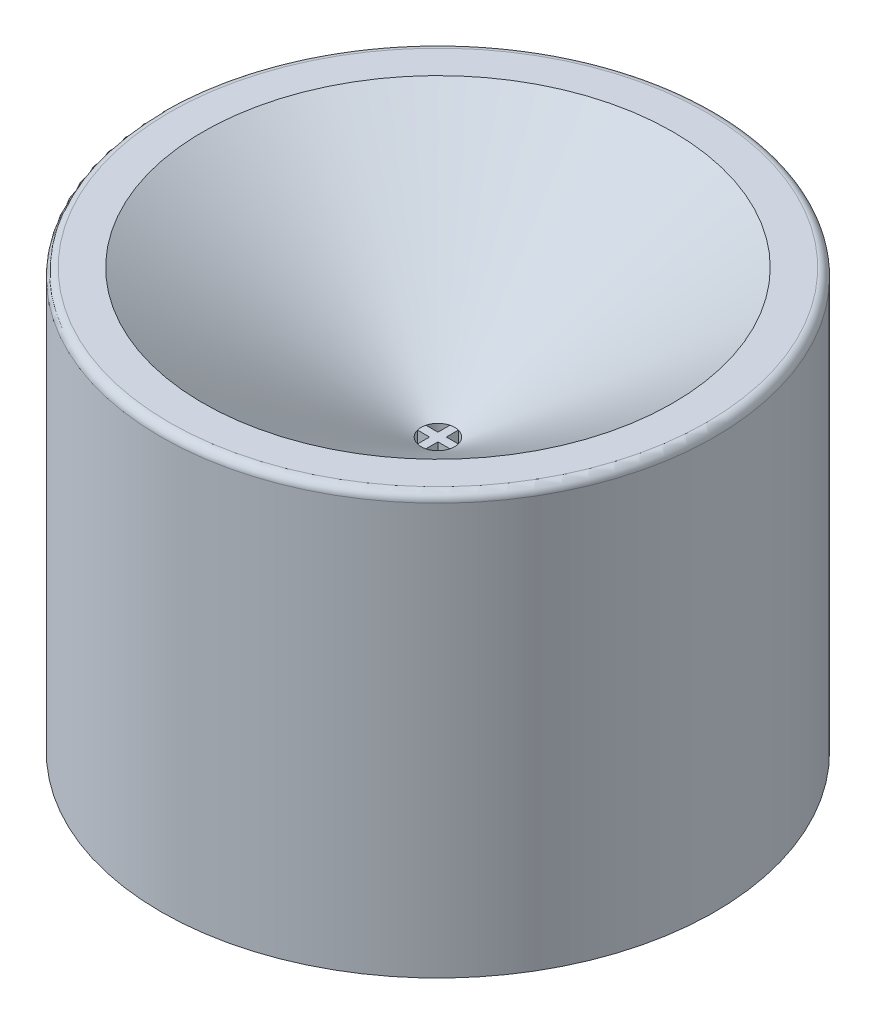
ISO-10303-21;
HEADER;
FILE_DESCRIPTION(('STEP AP214'),'2;1');
FILE_NAME('part.step','',(''),(''),'','','');
FILE_SCHEMA(('AUTOMOTIVE_DESIGN { 1 0 10303 214 1 1 1 1 }'));
ENDSEC;
DATA;
#1=APPLICATION_CONTEXT('core data for automotive mechanical design processes');
#2=APPLICATION_PROTOCOL_DEFINITION('international standard','automotive_design',2000,#1);
#3=PRODUCT_CONTEXT('',#1,'mechanical');
#4=PRODUCT('Part','Part','',(#3));
#5=PRODUCT_RELATED_PRODUCT_CATEGORY('part','',(#4));
#6=PRODUCT_DEFINITION_FORMATION('','',#4);
#7=PRODUCT_DEFINITION_CONTEXT('part definition',#1,'design');
#8=PRODUCT_DEFINITION('design','',#6,#7);
#9=PRODUCT_DEFINITION_SHAPE('','',#8);
#10=(LENGTH_UNIT() NAMED_UNIT(*) SI_UNIT(.MILLI.,.METRE.));
#11=(NAMED_UNIT(*) PLANE_ANGLE_UNIT() SI_UNIT($,.RADIAN.));
#12=(NAMED_UNIT(*) SI_UNIT($,.STERADIAN.) SOLID_ANGLE_UNIT());
#13=UNCERTAINTY_MEASURE_WITH_UNIT(LENGTH_MEASURE(1.E-05),#10,'distance_accuracy_value','');
#14=(GEOMETRIC_REPRESENTATION_CONTEXT(3) GLOBAL_UNCERTAINTY_ASSIGNED_CONTEXT((#13)) GLOBAL_UNIT_ASSIGNED_CONTEXT((#10,
#11,#12)) REPRESENTATION_CONTEXT('',''));
#15=CARTESIAN_POINT('',(0.,0.,0.));
#16=DIRECTION('',(0.,0.,1.));
#17=DIRECTION('',(1.,0.,0.));
#18=AXIS2_PLACEMENT_3D('',#15,#16,#17);
#19=CARTESIAN_POINT('',(-5.08,82.55,0.));
#20=DIRECTION('',(0.,1.,0.));
#21=DIRECTION('',(0.,0.,1.));
#22=AXIS2_PLACEMENT_3D('',#19,#20,#21);
#23=PLANE('',#22);
#24=DIRECTION('',(0.,0.,1.));
#25=VECTOR('',#24,1.);
#26=CARTESIAN_POINT('',(1.27,82.55,0.));
#27=LINE('',#26,#25);
#28=CARTESIAN_POINT('',(1.27,82.55,-4.91868884968342));
#29=VERTEX_POINT('',#28);
#30=CARTESIAN_POINT('',(1.27,82.55,-1.27));
#31=VERTEX_POINT('',#30);
#32=EDGE_CURVE('E55',#29,#31,#27,.T.);
#33=ORIENTED_EDGE('',*,*,#32,.F.);
#34=CARTESIAN_POINT('',(0.,82.55,0.));
#35=DIRECTION('',(0.,-1.,0.));
#36=DIRECTION('',(0.,0.,-1.));
#37=AXIS2_PLACEMENT_3D('',#34,#35,#36);
#38=CIRCLE('',#37,5.08);
#39=CARTESIAN_POINT('',(-1.27,82.55,-4.91868884968342));
#40=VERTEX_POINT('',#39);
#41=EDGE_CURVE('E229',#40,#29,#38,.T.);
#42=ORIENTED_EDGE('',*,*,#41,.F.);
#43=DIRECTION('',(0.,0.,1.));
#44=VECTOR('',#43,1.);
#45=CARTESIAN_POINT('',(-1.27,82.55,0.));
#46=LINE('',#45,#44);
#47=CARTESIAN_POINT('',(-1.27,82.55,-1.27));
#48=VERTEX_POINT('',#47);
#49=EDGE_CURVE('E212',#40,#48,#46,.T.);
#50=ORIENTED_EDGE('',*,*,#49,.T.);
#51=DIRECTION('',(1.,0.,0.));
#52=VECTOR('',#51,1.);
#53=CARTESIAN_POINT('',(0.,82.55,-1.27));
#54=LINE('',#53,#52);
#55=CARTESIAN_POINT('',(-4.91868884968342,82.55,-1.27));
#56=VERTEX_POINT('',#55);
#57=EDGE_CURVE('E210',#56,#48,#54,.T.);
#58=ORIENTED_EDGE('',*,*,#57,.F.);
#59=CARTESIAN_POINT('',(-4.91868884968342,82.55,1.27));
#60=VERTEX_POINT('',#59);
#61=EDGE_CURVE('E568',#60,#56,#38,.T.);
#62=ORIENTED_EDGE('',*,*,#61,.F.);
#63=DIRECTION('',(1.,0.,0.));
#64=VECTOR('',#63,1.);
#65=CARTESIAN_POINT('',(0.,82.55,1.27));
#66=LINE('',#65,#64);
#67=CARTESIAN_POINT('',(-1.27,82.55,1.27));
#68=VERTEX_POINT('',#67);
#69=EDGE_CURVE('E185',#60,#68,#66,.T.);
#70=ORIENTED_EDGE('',*,*,#69,.T.);
#71=DIRECTION('',(0.,0.,1.));
#72=VECTOR('',#71,1.);
#73=CARTESIAN_POINT('',(-1.27,82.55,0.));
#74=LINE('',#73,#72);
#75=CARTESIAN_POINT('',(-1.27,82.55,4.91868884968342));
#76=VERTEX_POINT('',#75);
#77=EDGE_CURVE('E190',#68,#76,#74,.T.);
#78=ORIENTED_EDGE('',*,*,#77,.T.);
#79=CARTESIAN_POINT('',(1.27,82.55,4.91868884968342));
#80=VERTEX_POINT('',#79);
#81=EDGE_CURVE('E565',#80,#76,#38,.T.);
#82=ORIENTED_EDGE('',*,*,#81,.F.);
#83=DIRECTION('',(0.,0.,1.));
#84=VECTOR('',#83,1.);
#85=CARTESIAN_POINT('',(1.27,82.55,0.));
#86=LINE('',#85,#84);
#87=CARTESIAN_POINT('',(1.27,82.55,1.27));
#88=VERTEX_POINT('',#87);
#89=EDGE_CURVE('E151',#88,#80,#86,.T.);
#90=ORIENTED_EDGE('',*,*,#89,.F.);
#91=DIRECTION('',(1.,0.,0.));
#92=VECTOR('',#91,1.);
#93=CARTESIAN_POINT('',(0.,82.55,1.27));
#94=LINE('',#93,#92);
#95=CARTESIAN_POINT('',(4.91868884968342,82.55,1.27));
#96=VERTEX_POINT('',#95);
#97=EDGE_CURVE('E63',#88,#96,#94,.T.);
#98=ORIENTED_EDGE('',*,*,#97,.T.);
#99=CARTESIAN_POINT('',(4.91868884968342,82.55,-1.27));
#100=VERTEX_POINT('',#99);
#101=EDGE_CURVE('E242',#100,#96,#38,.T.);
#102=ORIENTED_EDGE('',*,*,#101,.F.);
#103=DIRECTION('',(1.,0.,0.));
#104=VECTOR('',#103,1.);
#105=CARTESIAN_POINT('',(0.,82.55,-1.27));
#106=LINE('',#105,#104);
#107=EDGE_CURVE('E167',#31,#100,#106,.T.);
#108=ORIENTED_EDGE('',*,*,#107,.F.);
#109=EDGE_LOOP('',(#33,#42,#50,#58,#62,#70,#78,#82,#90,#98,#102,#108));
#110=FACE_BOUND('',#109,.T.);
#111=ADVANCED_FACE('F40',(#110),#23,.T.);
#112=CARTESIAN_POINT('',(-5.08,76.2,0.));
#113=DIRECTION('',(0.,1.,0.));
#114=DIRECTION('',(0.,0.,1.));
#115=AXIS2_PLACEMENT_3D('',#112,#113,#114);
#116=PLANE('',#115);
#117=CARTESIAN_POINT('',(0.,76.2,0.));
#118=DIRECTION('',(0.,1.,0.));
#119=DIRECTION('',(0.,0.,1.));
#120=AXIS2_PLACEMENT_3D('',#117,#118,#119);
#121=CIRCLE('',#120,5.08);
#122=CARTESIAN_POINT('',(1.27,76.2,-4.91868884968342));
#123=VERTEX_POINT('',#122);
#124=CARTESIAN_POINT('',(4.91868884968342,76.2,-1.27));
#125=VERTEX_POINT('',#124);
#126=EDGE_CURVE('E160',#123,#125,#121,.F.);
#127=ORIENTED_EDGE('',*,*,#126,.F.);
#128=DIRECTION('',(0.,0.,-1.));
#129=VECTOR('',#128,1.);
#130=CARTESIAN_POINT('',(1.27,76.2,0.));
#131=LINE('',#130,#129);
#132=CARTESIAN_POINT('',(1.26999999999999,76.2,-1.27));
#133=VERTEX_POINT('',#132);
#134=EDGE_CURVE('E162',#133,#123,#131,.T.);
#135=ORIENTED_EDGE('',*,*,#134,.F.);
#136=DIRECTION('',(-1.,0.,0.));
#137=VECTOR('',#136,1.);
#138=CARTESIAN_POINT('',(0.,76.2,-1.27));
#139=LINE('',#138,#137);
#140=EDGE_CURVE('E173',#125,#133,#139,.T.);
#141=ORIENTED_EDGE('',*,*,#140,.F.);
#142=EDGE_LOOP('',(#127,#135,#141));
#143=FACE_BOUND('',#142,.T.);
#144=DIRECTION('',(-1.,0.,0.));
#145=VECTOR('',#144,1.);
#146=CARTESIAN_POINT('',(0.,76.2,1.27));
#147=LINE('',#146,#145);
#148=CARTESIAN_POINT('',(4.91868884968342,76.2,1.27));
#149=VERTEX_POINT('',#148);
#150=CARTESIAN_POINT('',(1.27,76.2,1.27));
#151=VERTEX_POINT('',#150);
#152=EDGE_CURVE('E131',#149,#151,#147,.T.);
#153=ORIENTED_EDGE('',*,*,#152,.T.);
#154=DIRECTION('',(0.,0.,-1.));
#155=VECTOR('',#154,1.);
#156=CARTESIAN_POINT('',(1.27,76.2,0.));
#157=LINE('',#156,#155);
#158=CARTESIAN_POINT('',(1.27,76.2,4.91868884968342));
#159=VERTEX_POINT('',#158);
#160=EDGE_CURVE('E141',#159,#151,#157,.T.);
#161=ORIENTED_EDGE('',*,*,#160,.F.);
#162=CARTESIAN_POINT('',(0.,76.2,0.));
#163=DIRECTION('',(0.,1.,0.));
#164=DIRECTION('',(0.,0.,1.));
#165=AXIS2_PLACEMENT_3D('',#162,#163,#164);
#166=CIRCLE('',#165,5.08);
#167=EDGE_CURVE('E149',#149,#159,#166,.F.);
#168=ORIENTED_EDGE('',*,*,#167,.F.);
#169=EDGE_LOOP('',(#153,#161,#168));
#170=FACE_BOUND('',#169,.T.);
#171=DIRECTION('',(0.,0.,-1.));
#172=VECTOR('',#171,1.);
#173=CARTESIAN_POINT('',(-1.27,76.2,0.));
#174=LINE('',#173,#172);
#175=CARTESIAN_POINT('',(-1.27,76.2,-1.27));
#176=VERTEX_POINT('',#175);
#177=CARTESIAN_POINT('',(-1.27,76.2,-4.91868884968342));
#178=VERTEX_POINT('',#177);
#179=EDGE_CURVE('E179',#176,#178,#174,.T.);
#180=ORIENTED_EDGE('',*,*,#179,.T.);
#181=CARTESIAN_POINT('',(0.,76.2,0.));
#182=DIRECTION('',(0.,1.,0.));
#183=DIRECTION('',(0.,0.,1.));
#184=AXIS2_PLACEMENT_3D('',#181,#182,#183);
#185=CIRCLE('',#184,5.08);
#186=CARTESIAN_POINT('',(-4.91868884968343,76.2,-1.27));
#187=VERTEX_POINT('',#186);
#188=EDGE_CURVE('E204',#187,#178,#185,.F.);
#189=ORIENTED_EDGE('',*,*,#188,.F.);
#190=DIRECTION('',(-1.,0.,0.));
#191=VECTOR('',#190,1.);
#192=CARTESIAN_POINT('',(0.,76.2,-1.27));
#193=LINE('',#192,#191);
#194=EDGE_CURVE('E218',#176,#187,#193,.T.);
#195=ORIENTED_EDGE('',*,*,#194,.F.);
#196=EDGE_LOOP('',(#180,#189,#195));
#197=FACE_BOUND('',#196,.T.);
#198=CARTESIAN_POINT('',(0.,76.2,0.));
#199=DIRECTION('',(0.,1.,0.));
#200=DIRECTION('',(0.,0.,1.));
#201=AXIS2_PLACEMENT_3D('',#198,#199,#200);
#202=CIRCLE('',#201,7.01797206237305);
#203=CARTESIAN_POINT('',(0.,76.2,7.01797206237304));
#204=VERTEX_POINT('',#203);
#205=EDGE_CURVE('E225',#204,#204,#202,.F.);
#206=ORIENTED_EDGE('',*,*,#205,.T.);
#207=EDGE_LOOP('',(#206));
#208=FACE_BOUND('',#207,.T.);
#209=DIRECTION('',(-1.,0.,0.));
#210=VECTOR('',#209,1.);
#211=CARTESIAN_POINT('',(0.,76.2,1.27));
#212=LINE('',#211,#210);
#213=CARTESIAN_POINT('',(-1.27,76.2,1.27));
#214=VERTEX_POINT('',#213);
#215=CARTESIAN_POINT('',(-4.91868884968342,76.2,1.27));
#216=VERTEX_POINT('',#215);
#217=EDGE_CURVE('E182',#214,#216,#212,.T.);
#218=ORIENTED_EDGE('',*,*,#217,.T.);
#219=CARTESIAN_POINT('',(0.,76.2,0.));
#220=DIRECTION('',(0.,1.,0.));
#221=DIRECTION('',(0.,0.,1.));
#222=AXIS2_PLACEMENT_3D('',#219,#220,#221);
#223=CIRCLE('',#222,5.08);
#224=CARTESIAN_POINT('',(-1.27,76.2,4.91868884968342));
#225=VERTEX_POINT('',#224);
#226=EDGE_CURVE('E163',#225,#216,#223,.F.);
#227=ORIENTED_EDGE('',*,*,#226,.F.);
#228=DIRECTION('',(0.,0.,-1.));
#229=VECTOR('',#228,1.);
#230=CARTESIAN_POINT('',(-1.27,76.2,0.));
#231=LINE('',#230,#229);
#232=EDGE_CURVE('E144',#225,#214,#231,.T.);
#233=ORIENTED_EDGE('',*,*,#232,.T.);
#234=EDGE_LOOP('',(#218,#227,#233));
#235=FACE_BOUND('',#234,.T.);
#236=ADVANCED_FACE('F147',(#143,#170,#197,#208,#235),#116,.F.);
#237=CARTESIAN_POINT('',(0.,127.,0.));
#238=DIRECTION('',(0.,-1.,0.));
#239=DIRECTION('',(0.,0.,-1.));
#240=AXIS2_PLACEMENT_3D('',#237,#238,#239);
#241=CYLINDRICAL_SURFACE('',#240,83.82);
#242=CARTESIAN_POINT('',(0.,124.46,0.));
#243=DIRECTION('',(0.,1.,0.));
#244=DIRECTION('',(0.,0.,1.));
#245=AXIS2_PLACEMENT_3D('',#242,#243,#244);
#246=CIRCLE('',#245,83.82);
#247=CARTESIAN_POINT('',(0.,124.46,83.82));
#248=VERTEX_POINT('',#247);
#249=EDGE_CURVE('E11',#248,#248,#246,.F.);
#250=ORIENTED_EDGE('',*,*,#249,.T.);
#251=EDGE_LOOP('',(#250));
#252=FACE_BOUND('',#251,.T.);
#253=CARTESIAN_POINT('',(0.,0.,0.));
#254=DIRECTION('',(0.,1.,0.));
#255=DIRECTION('',(0.,0.,1.));
#256=AXIS2_PLACEMENT_3D('',#253,#254,#255);
#257=CIRCLE('',#256,83.82);
#258=CARTESIAN_POINT('',(0.,0.,83.82));
#259=VERTEX_POINT('',#258);
#260=EDGE_CURVE('E245',#259,#259,#257,.T.);
#261=ORIENTED_EDGE('',*,*,#260,.T.);
#262=EDGE_LOOP('',(#261));
#263=FACE_BOUND('',#262,.T.);
#264=ADVANCED_FACE('F269',(#252,#263),#241,.T.);
#265=CARTESIAN_POINT('',(0.,127.,0.));
#266=DIRECTION('',(0.,1.,0.));
#267=DIRECTION('',(0.,0.,1.));
#268=AXIS2_PLACEMENT_3D('',#265,#266,#267);
#269=PLANE('',#268);
#270=CARTESIAN_POINT('',(0.,127.,0.));
#271=DIRECTION('',(0.,1.,0.));
#272=DIRECTION('',(0.,0.,1.));
#273=AXIS2_PLACEMENT_3D('',#270,#271,#272);
#274=CIRCLE('',#273,81.28);
#275=CARTESIAN_POINT('',(0.,127.,81.28));
#276=VERTEX_POINT('',#275);
#277=EDGE_CURVE('E48',#276,#276,#274,.T.);
#278=ORIENTED_EDGE('',*,*,#277,.T.);
#279=EDGE_LOOP('',(#278));
#280=FACE_BOUND('',#279,.T.);
#281=CARTESIAN_POINT('',(0.,127.,0.));
#282=DIRECTION('',(0.,-1.,0.));
#283=DIRECTION('',(0.,0.,-1.));
#284=AXIS2_PLACEMENT_3D('',#281,#282,#283);
#285=CIRCLE('',#284,71.12);
#286=CARTESIAN_POINT('',(0.,127.,-71.12));
#287=VERTEX_POINT('',#286);
#288=EDGE_CURVE('E241',#287,#287,#285,.T.);
#289=ORIENTED_EDGE('',*,*,#288,.T.);
#290=EDGE_LOOP('',(#289));
#291=FACE_BOUND('',#290,.T.);
#292=ADVANCED_FACE('F250',(#280,#291),#269,.T.);
#293=CARTESIAN_POINT('',(0.,0.,0.));
#294=DIRECTION('',(0.,1.,0.));
#295=DIRECTION('',(0.,0.,1.));
#296=AXIS2_PLACEMENT_3D('',#293,#294,#295);
#297=PLANE('',#296);
#298=CARTESIAN_POINT('',(0.,0.,0.));
#299=DIRECTION('',(0.,1.,0.));
#300=DIRECTION('',(0.,0.,1.));
#301=AXIS2_PLACEMENT_3D('',#298,#299,#300);
#302=CIRCLE('',#301,77.47);
#303=CARTESIAN_POINT('',(0.,0.,77.47));
#304=VERTEX_POINT('',#303);
#305=EDGE_CURVE('E230',#304,#304,#302,.T.);
#306=ORIENTED_EDGE('',*,*,#305,.T.);
#307=EDGE_LOOP('',(#306));
#308=FACE_BOUND('',#307,.T.);
#309=ORIENTED_EDGE('',*,*,#260,.F.);
#310=EDGE_LOOP('',(#309));
#311=FACE_BOUND('',#310,.T.);
#312=ADVANCED_FACE('F278',(#308,#311),#297,.F.);
#313=CARTESIAN_POINT('',(0.,82.55,0.));
#314=DIRECTION('',(0.,1.,0.));
#315=DIRECTION('',(0.,0.,1.));
#316=AXIS2_PLACEMENT_3D('',#313,#314,#315);
#317=CONICAL_SURFACE('',#316,5.08,0.978368973363018);
#318=ORIENTED_EDGE('',*,*,#288,.F.);
#319=EDGE_LOOP('',(#318));
#320=FACE_BOUND('',#319,.T.);
#321=EDGE_CURVE('E238',#29,#100,#38,.T.);
#322=ORIENTED_EDGE('',*,*,#321,.T.);
#323=ORIENTED_EDGE('',*,*,#101,.T.);
#324=CARTESIAN_POINT('',(0.,82.55,0.));
#325=DIRECTION('',(0.,1.,0.));
#326=DIRECTION('',(0.,0.,1.));
#327=AXIS2_PLACEMENT_3D('',#324,#325,#326);
#328=CIRCLE('',#327,5.08);
#329=EDGE_CURVE('E137',#80,#96,#328,.T.);
#330=ORIENTED_EDGE('',*,*,#329,.F.);
#331=ORIENTED_EDGE('',*,*,#81,.T.);
#332=CARTESIAN_POINT('',(0.,82.55,0.));
#333=DIRECTION('',(0.,1.,0.));
#334=DIRECTION('',(0.,0.,1.));
#335=AXIS2_PLACEMENT_3D('',#332,#333,#334);
#336=CIRCLE('',#335,5.08);
#337=EDGE_CURVE('E188',#60,#76,#336,.T.);
#338=ORIENTED_EDGE('',*,*,#337,.F.);
#339=ORIENTED_EDGE('',*,*,#61,.T.);
#340=CARTESIAN_POINT('',(0.,82.55,0.));
#341=DIRECTION('',(0.,1.,0.));
#342=DIRECTION('',(0.,0.,1.));
#343=AXIS2_PLACEMENT_3D('',#340,#341,#342);
#344=CIRCLE('',#343,5.08);
#345=EDGE_CURVE('E207',#40,#56,#344,.T.);
#346=ORIENTED_EDGE('',*,*,#345,.F.);
#347=ORIENTED_EDGE('',*,*,#41,.T.);
#348=EDGE_LOOP('',(#322,#323,#330,#331,#338,#339,#346,#347));
#349=FACE_BOUND('',#348,.T.);
#350=ADVANCED_FACE('F274',(#320,#349),#317,.F.);
#351=CARTESIAN_POINT('',(0.,127.,0.));
#352=DIRECTION('',(0.,-1.,0.));
#353=DIRECTION('',(0.,0.,-1.));
#354=AXIS2_PLACEMENT_3D('',#351,#352,#353);
#355=CYLINDRICAL_SURFACE('',#354,77.47);
#356=CARTESIAN_POINT('',(0.,120.65,0.));
#357=DIRECTION('',(0.,1.,0.));
#358=DIRECTION('',(0.,0.,1.));
#359=AXIS2_PLACEMENT_3D('',#356,#357,#358);
#360=CIRCLE('',#359,77.47);
#361=CARTESIAN_POINT('',(0.,120.65,77.47));
#362=VERTEX_POINT('',#361);
#363=EDGE_CURVE('E226',#362,#362,#360,.T.);
#364=ORIENTED_EDGE('',*,*,#363,.T.);
#365=EDGE_LOOP('',(#364));
#366=FACE_BOUND('',#365,.T.);
#367=ORIENTED_EDGE('',*,*,#305,.F.);
#368=EDGE_LOOP('',(#367));
#369=FACE_BOUND('',#368,.T.);
#370=ADVANCED_FACE('F277',(#366,#369),#355,.F.);
#371=CARTESIAN_POINT('',(0.,120.65,0.));
#372=DIRECTION('',(0.,1.,0.));
#373=DIRECTION('',(0.,0.,1.));
#374=AXIS2_PLACEMENT_3D('',#371,#372,#373);
#375=PLANE('',#374);
#376=CARTESIAN_POINT('',(0.,120.65,0.));
#377=DIRECTION('',(0.,1.,0.));
#378=DIRECTION('',(0.,0.,1.));
#379=AXIS2_PLACEMENT_3D('',#376,#377,#378);
#380=CIRCLE('',#379,73.057972062373);
#381=CARTESIAN_POINT('',(0.,120.65,73.057972062373));
#382=VERTEX_POINT('',#381);
#383=EDGE_CURVE('E231',#382,#382,#380,.F.);
#384=ORIENTED_EDGE('',*,*,#383,.F.);
#385=EDGE_LOOP('',(#384));
#386=FACE_BOUND('',#385,.T.);
#387=ORIENTED_EDGE('',*,*,#363,.F.);
#388=EDGE_LOOP('',(#387));
#389=FACE_BOUND('',#388,.T.);
#390=ADVANCED_FACE('F311',(#386,#389),#375,.F.);
#391=CARTESIAN_POINT('',(0.,77.2821178026167,0.));
#392=DIRECTION('',(0.,1.,0.));
#393=DIRECTION('',(0.,0.,1.));
#394=AXIS2_PLACEMENT_3D('',#391,#392,#393);
#395=CONICAL_SURFACE('',#394,8.62568994054644,0.978368973363018);
#396=CARTESIAN_POINT('',(0.,120.65,73.057972062373));
#397=CARTESIAN_POINT('',(0.,120.186979166667,72.3700553957064));
#398=CARTESIAN_POINT('',(0.,119.723958333333,71.6821387290397));
#399=CARTESIAN_POINT('',(0.,118.797916666667,70.3063053957064));
#400=CARTESIAN_POINT('',(0.,118.334895833333,69.6183887290397));
#401=CARTESIAN_POINT('',(0.,117.408854166667,68.2425553957064));
#402=CARTESIAN_POINT('',(0.,116.945833333333,67.5546387290397));
#403=CARTESIAN_POINT('',(0.,116.019791666667,66.1788053957064));
#404=CARTESIAN_POINT('',(0.,115.556770833333,65.4908887290397));
#405=CARTESIAN_POINT('',(0.,114.630729166667,64.1150553957064));
#406=CARTESIAN_POINT('',(0.,114.167708333333,63.4271387290397));
#407=CARTESIAN_POINT('',(0.,113.241666666667,62.0513053957064));
#408=CARTESIAN_POINT('',(0.,112.778645833333,61.3633887290397));
#409=CARTESIAN_POINT('',(0.,111.852604166667,59.9875553957064));
#410=CARTESIAN_POINT('',(0.,111.389583333333,59.2996387290397));
#411=CARTESIAN_POINT('',(0.,110.463541666667,57.9238053957064));
#412=CARTESIAN_POINT('',(0.,110.000520833333,57.2358887290397));
#413=CARTESIAN_POINT('',(0.,109.074479166667,55.8600553957064));
#414=CARTESIAN_POINT('',(0.,108.611458333333,55.1721387290397));
#415=CARTESIAN_POINT('',(0.,107.685416666667,53.7963053957064));
#416=CARTESIAN_POINT('',(0.,107.222395833333,53.1083887290397));
#417=CARTESIAN_POINT('',(0.,106.296354166667,51.7325553957064));
#418=CARTESIAN_POINT('',(0.,105.833333333333,51.0446387290397));
#419=CARTESIAN_POINT('',(0.,104.907291666667,49.6688053957064));
#420=CARTESIAN_POINT('',(0.,104.444270833333,48.9808887290397));
#421=CARTESIAN_POINT('',(0.,103.518229166667,47.6050553957064));
#422=CARTESIAN_POINT('',(0.,103.055208333333,46.9171387290397));
#423=CARTESIAN_POINT('',(0.,102.129166666667,45.5413053957064));
#424=CARTESIAN_POINT('',(0.,101.666145833333,44.8533887290397));
#425=CARTESIAN_POINT('',(0.,100.740104166667,43.4775553957064));
#426=CARTESIAN_POINT('',(0.,100.277083333333,42.7896387290397));
#427=CARTESIAN_POINT('',(0.,99.3510416666667,41.4138053957064));
#428=CARTESIAN_POINT('',(0.,98.8880208333333,40.7258887290397));
#429=CARTESIAN_POINT('',(0.,97.9619791666667,39.3500553957064));
#430=CARTESIAN_POINT('',(0.,97.4989583333333,38.6621387290397));
#431=CARTESIAN_POINT('',(0.,96.5729166666667,37.2863053957064));
#432=CARTESIAN_POINT('',(0.,96.1098958333333,36.5983887290397));
#433=CARTESIAN_POINT('',(0.,95.1838541666667,35.2225553957064));
#434=CARTESIAN_POINT('',(0.,94.7208333333333,34.5346387290397));
#435=CARTESIAN_POINT('',(0.,93.7947916666667,33.1588053957064));
#436=CARTESIAN_POINT('',(0.,93.3317708333333,32.4708887290397));
#437=CARTESIAN_POINT('',(0.,92.4057291666667,31.0950553957064));
#438=CARTESIAN_POINT('',(0.,91.9427083333333,30.4071387290397));
#439=CARTESIAN_POINT('',(0.,91.0166666666667,29.0313053957064));
#440=CARTESIAN_POINT('',(0.,90.5536458333333,28.3433887290397));
#441=CARTESIAN_POINT('',(0.,89.6276041666667,26.9675553957064));
#442=CARTESIAN_POINT('',(0.,89.1645833333333,26.2796387290397));
#443=CARTESIAN_POINT('',(0.,88.2385416666667,24.9038053957064));
#444=CARTESIAN_POINT('',(0.,87.7755208333333,24.2158887290397));
#445=CARTESIAN_POINT('',(0.,86.8494791666667,22.8400553957064));
#446=CARTESIAN_POINT('',(0.,86.3864583333334,22.1521387290397));
#447=CARTESIAN_POINT('',(0.,85.4604166666667,20.7763053957064));
#448=CARTESIAN_POINT('',(0.,84.9973958333333,20.0883887290397));
#449=CARTESIAN_POINT('',(0.,84.0713541666667,18.7125553957064));
#450=CARTESIAN_POINT('',(0.,83.6083333333333,18.0246387290397));
#451=CARTESIAN_POINT('',(0.,82.6822916666667,16.6488053957064));
#452=CARTESIAN_POINT('',(0.,82.2192708333333,15.9608887290397));
#453=CARTESIAN_POINT('',(0.,81.2932291666667,14.5850553957064));
#454=CARTESIAN_POINT('',(0.,80.8302083333333,13.8971387290397));
#455=CARTESIAN_POINT('',(0.,79.9041666666667,12.5213053957064));
#456=CARTESIAN_POINT('',(0.,79.4411458333333,11.8333887290397));
#457=CARTESIAN_POINT('',(0.,78.5151041666667,10.4575553957064));
#458=CARTESIAN_POINT('',(0.,78.0520833333333,9.76963872903971));
#459=CARTESIAN_POINT('',(0.,77.1260416666667,8.39380539570638));
#460=CARTESIAN_POINT('',(0.,76.6630208333333,7.70588872903971));
#461=CARTESIAN_POINT('',(0.,76.2,7.01797206237304));
#462=B_SPLINE_CURVE_WITH_KNOTS('',3,(#396,#397,#398,#399,#400,#401,#402,#403,#404,#405,#406,
#407,#408,#409,#410,#411,#412,#413,#414,#415,#416,#417,#418,#419,#420,#421,#422,#423,#424,#425,
#426,#427,#428,#429,#430,#431,#432,#433,#434,#435,#436,#437,#438,#439,#440,#441,#442,#443,#444,
#445,#446,#447,#448,#449,#450,#451,#452,#453,#454,#455,#456,#457,#458,#459,#460,#461),
.UNSPECIFIED.,.F.,.F.,(4,2,2,2,2,2,2,2,2,2,2,2,2,2,2,2,2,2,2,2,2,2,2,2,2,2,2,2,2,2,2,2,4),(0.,
2.48768138864409,4.9753627772882,7.46304416593229,9.9507255545764,12.4384069432205,
14.9260883318646,17.4137697205087,19.9014511091528,22.3891324977969,24.876813886441,
27.3644952750851,29.8521766637292,32.3398580523733,34.8275394410174,37.3152208296615,
39.8029022183056,42.2905836069497,44.7782649955938,47.2659463842379,49.753627772882,
52.2413091615261,54.7289905501702,57.2166719388143,59.7043533274584,62.1920347161025,
64.6797161047466,67.1673974933908,69.6550788820349,72.142760270679,74.6304416593231,
77.1181230479672,79.6058044366113),.UNSPECIFIED.);
#463=EDGE_CURVE('BSEAM319',#382,#204,#462,.T.);
#464=ORIENTED_EDGE('',*,*,#383,.T.);
#465=ORIENTED_EDGE('',*,*,#205,.F.);
#466=ORIENTED_EDGE('',*,*,#463,.T.);
#467=ORIENTED_EDGE('',*,*,#463,.F.);
#468=EDGE_LOOP('',(#464,#466,#465,#467));
#469=FACE_BOUND('',#468,.T.);
#470=ADVANCED_FACE('F319',(#469),#395,.T.);
#471=CARTESIAN_POINT('',(0.,-0.00100000000001488,0.));
#472=DIRECTION('',(0.,1.,0.));
#473=DIRECTION('',(-1.,0.,0.));
#474=AXIS2_PLACEMENT_3D('',#471,#472,#473);
#475=CYLINDRICAL_SURFACE('',#474,5.08);
#476=ORIENTED_EDGE('',*,*,#188,.T.);
#477=DIRECTION('',(0.,1.,0.));
#478=VECTOR('',#477,1.);
#479=CARTESIAN_POINT('',(-1.27000000000001,-0.00100000000001488,-4.91868884968342));
#480=LINE('',#479,#478);
#481=EDGE_CURVE('E216',#178,#40,#480,.T.);
#482=ORIENTED_EDGE('',*,*,#481,.T.);
#483=ORIENTED_EDGE('',*,*,#345,.T.);
#484=DIRECTION('',(0.,1.,0.));
#485=VECTOR('',#484,1.);
#486=CARTESIAN_POINT('',(-4.91868884968343,-0.00100000000001488,-1.27));
#487=LINE('',#486,#485);
#488=EDGE_CURVE('E215',#187,#56,#487,.T.);
#489=ORIENTED_EDGE('',*,*,#488,.F.);
#490=EDGE_LOOP('',(#476,#482,#483,#489));
#491=FACE_BOUND('',#490,.T.);
#492=ADVANCED_FACE('F327',(#491),#475,.F.);
#493=CARTESIAN_POINT('',(-1.27000000000001,-0.00100000000001488,0.));
#494=DIRECTION('',(-1.,0.,0.));
#495=DIRECTION('',(0.,-1.,0.));
#496=AXIS2_PLACEMENT_3D('',#493,#494,#495);
#497=PLANE('',#496);
#498=DIRECTION('',(0.,1.,0.));
#499=VECTOR('',#498,1.);
#500=CARTESIAN_POINT('',(-1.27000000000001,-0.00100000000001488,-1.27));
#501=LINE('',#500,#499);
#502=EDGE_CURVE('E219',#176,#48,#501,.T.);
#503=ORIENTED_EDGE('',*,*,#502,.T.);
#504=ORIENTED_EDGE('',*,*,#49,.F.);
#505=ORIENTED_EDGE('',*,*,#481,.F.);
#506=ORIENTED_EDGE('',*,*,#179,.F.);
#507=EDGE_LOOP('',(#503,#504,#505,#506));
#508=FACE_BOUND('',#507,.T.);
#509=ADVANCED_FACE('F334',(#508),#497,.T.);
#510=CARTESIAN_POINT('',(0.,-0.00100000000001488,-1.27));
#511=DIRECTION('',(0.,0.,1.));
#512=DIRECTION('',(1.,0.,0.));
#513=AXIS2_PLACEMENT_3D('',#510,#511,#512);
#514=PLANE('',#513);
#515=ORIENTED_EDGE('',*,*,#194,.T.);
#516=ORIENTED_EDGE('',*,*,#488,.T.);
#517=ORIENTED_EDGE('',*,*,#57,.T.);
#518=ORIENTED_EDGE('',*,*,#502,.F.);
#519=EDGE_LOOP('',(#515,#516,#517,#518));
#520=FACE_BOUND('',#519,.T.);
#521=ADVANCED_FACE('F342',(#520),#514,.F.);
#522=CARTESIAN_POINT('',(0.,-0.00100000000001488,1.27));
#523=DIRECTION('',(0.,0.,1.));
#524=DIRECTION('',(1.,0.,0.));
#525=AXIS2_PLACEMENT_3D('',#522,#523,#524);
#526=PLANE('',#525);
#527=DIRECTION('',(0.,1.,0.));
#528=VECTOR('',#527,1.);
#529=CARTESIAN_POINT('',(4.91868884968341,-0.00100000000001488,1.27));
#530=LINE('',#529,#528);
#531=EDGE_CURVE('E145',#149,#96,#530,.T.);
#532=ORIENTED_EDGE('',*,*,#531,.T.);
#533=ORIENTED_EDGE('',*,*,#97,.F.);
#534=DIRECTION('',(0.,1.,0.));
#535=VECTOR('',#534,1.);
#536=CARTESIAN_POINT('',(1.26999999999999,-0.00100000000001488,1.27));
#537=LINE('',#536,#535);
#538=EDGE_CURVE('E127',#151,#88,#537,.T.);
#539=ORIENTED_EDGE('',*,*,#538,.F.);
#540=ORIENTED_EDGE('',*,*,#152,.F.);
#541=EDGE_LOOP('',(#532,#533,#539,#540));
#542=FACE_BOUND('',#541,.T.);
#543=ADVANCED_FACE('F129',(#542),#526,.T.);
#544=CARTESIAN_POINT('',(0.,-0.00100000000001488,0.));
#545=DIRECTION('',(0.,1.,0.));
#546=DIRECTION('',(-1.,0.,0.));
#547=AXIS2_PLACEMENT_3D('',#544,#545,#546);
#548=CYLINDRICAL_SURFACE('',#547,5.08);
#549=ORIENTED_EDGE('',*,*,#167,.T.);
#550=DIRECTION('',(0.,1.,0.));
#551=VECTOR('',#550,1.);
#552=CARTESIAN_POINT('',(1.26999999999999,-0.00100000000001488,4.91868884968342));
#553=LINE('',#552,#551);
#554=EDGE_CURVE('E136',#159,#80,#553,.T.);
#555=ORIENTED_EDGE('',*,*,#554,.T.);
#556=ORIENTED_EDGE('',*,*,#329,.T.);
#557=ORIENTED_EDGE('',*,*,#531,.F.);
#558=EDGE_LOOP('',(#549,#555,#556,#557));
#559=FACE_BOUND('',#558,.T.);
#560=ADVANCED_FACE('F357',(#559),#548,.F.);
#561=CARTESIAN_POINT('',(1.26999999999999,-0.00100000000001488,0.));
#562=DIRECTION('',(-1.,0.,0.));
#563=DIRECTION('',(0.,-1.,0.));
#564=AXIS2_PLACEMENT_3D('',#561,#562,#563);
#565=PLANE('',#564);
#566=ORIENTED_EDGE('',*,*,#160,.T.);
#567=ORIENTED_EDGE('',*,*,#538,.T.);
#568=ORIENTED_EDGE('',*,*,#89,.T.);
#569=ORIENTED_EDGE('',*,*,#554,.F.);
#570=EDGE_LOOP('',(#566,#567,#568,#569));
#571=FACE_BOUND('',#570,.T.);
#572=ADVANCED_FACE('F142',(#571),#565,.F.);
#573=CARTESIAN_POINT('',(0.,-0.00100000000001488,1.27));
#574=DIRECTION('',(0.,0.,1.));
#575=DIRECTION('',(1.,0.,0.));
#576=AXIS2_PLACEMENT_3D('',#573,#574,#575);
#577=PLANE('',#576);
#578=DIRECTION('',(0.,1.,0.));
#579=VECTOR('',#578,1.);
#580=CARTESIAN_POINT('',(-1.27000000000001,-0.00100000000001488,1.27));
#581=LINE('',#580,#579);
#582=EDGE_CURVE('E194',#214,#68,#581,.T.);
#583=ORIENTED_EDGE('',*,*,#582,.T.);
#584=ORIENTED_EDGE('',*,*,#69,.F.);
#585=DIRECTION('',(0.,1.,0.));
#586=VECTOR('',#585,1.);
#587=CARTESIAN_POINT('',(-4.91868884968343,-0.00100000000001488,1.27));
#588=LINE('',#587,#586);
#589=EDGE_CURVE('E193',#216,#60,#588,.T.);
#590=ORIENTED_EDGE('',*,*,#589,.F.);
#591=ORIENTED_EDGE('',*,*,#217,.F.);
#592=EDGE_LOOP('',(#583,#584,#590,#591));
#593=FACE_BOUND('',#592,.T.);
#594=ADVANCED_FACE('F371',(#593),#577,.T.);
#595=CARTESIAN_POINT('',(-1.27000000000001,-0.00100000000001488,0.));
#596=DIRECTION('',(-1.,0.,0.));
#597=DIRECTION('',(0.,-1.,0.));
#598=AXIS2_PLACEMENT_3D('',#595,#596,#597);
#599=PLANE('',#598);
#600=DIRECTION('',(0.,1.,0.));
#601=VECTOR('',#600,1.);
#602=CARTESIAN_POINT('',(-1.27000000000001,-0.00100000000001488,4.91868884968342));
#603=LINE('',#602,#601);
#604=EDGE_CURVE('E196',#225,#76,#603,.T.);
#605=ORIENTED_EDGE('',*,*,#604,.T.);
#606=ORIENTED_EDGE('',*,*,#77,.F.);
#607=ORIENTED_EDGE('',*,*,#582,.F.);
#608=ORIENTED_EDGE('',*,*,#232,.F.);
#609=EDGE_LOOP('',(#605,#606,#607,#608));
#610=FACE_BOUND('',#609,.T.);
#611=ADVANCED_FACE('F378',(#610),#599,.T.);
#612=CARTESIAN_POINT('',(0.,-0.00100000000001488,0.));
#613=DIRECTION('',(0.,1.,0.));
#614=DIRECTION('',(-1.,0.,0.));
#615=AXIS2_PLACEMENT_3D('',#612,#613,#614);
#616=CYLINDRICAL_SURFACE('',#615,5.08);
#617=ORIENTED_EDGE('',*,*,#226,.T.);
#618=ORIENTED_EDGE('',*,*,#589,.T.);
#619=ORIENTED_EDGE('',*,*,#337,.T.);
#620=ORIENTED_EDGE('',*,*,#604,.F.);
#621=EDGE_LOOP('',(#617,#618,#619,#620));
#622=FACE_BOUND('',#621,.T.);
#623=ADVANCED_FACE('F386',(#622),#616,.F.);
#624=CARTESIAN_POINT('',(1.26999999999999,-0.00100000000001488,0.));
#625=DIRECTION('',(-1.,0.,0.));
#626=DIRECTION('',(0.,-1.,0.));
#627=AXIS2_PLACEMENT_3D('',#624,#625,#626);
#628=PLANE('',#627);
#629=ORIENTED_EDGE('',*,*,#134,.T.);
#630=DIRECTION('',(0.,1.,0.));
#631=VECTOR('',#630,1.);
#632=CARTESIAN_POINT('',(1.26999999999999,-0.00100000000001488,-4.91868884968342));
#633=LINE('',#632,#631);
#634=EDGE_CURVE('E171',#123,#29,#633,.T.);
#635=ORIENTED_EDGE('',*,*,#634,.T.);
#636=ORIENTED_EDGE('',*,*,#32,.T.);
#637=DIRECTION('',(0.,1.,0.));
#638=VECTOR('',#637,1.);
#639=CARTESIAN_POINT('',(1.26999999999999,-0.00100000000001488,-1.27));
#640=LINE('',#639,#638);
#641=EDGE_CURVE('E170',#133,#31,#640,.T.);
#642=ORIENTED_EDGE('',*,*,#641,.F.);
#643=EDGE_LOOP('',(#629,#635,#636,#642));
#644=FACE_BOUND('',#643,.T.);
#645=ADVANCED_FACE('F394',(#644),#628,.F.);
#646=CARTESIAN_POINT('',(0.,-0.00100000000001488,0.));
#647=DIRECTION('',(0.,1.,0.));
#648=DIRECTION('',(-1.,0.,0.));
#649=AXIS2_PLACEMENT_3D('',#646,#647,#648);
#650=CYLINDRICAL_SURFACE('',#649,5.08);
#651=ORIENTED_EDGE('',*,*,#126,.T.);
#652=DIRECTION('',(0.,1.,0.));
#653=VECTOR('',#652,1.);
#654=CARTESIAN_POINT('',(4.91868884968341,-0.00100000000001488,-1.27));
#655=LINE('',#654,#653);
#656=EDGE_CURVE('E174',#125,#100,#655,.T.);
#657=ORIENTED_EDGE('',*,*,#656,.T.);
#658=ORIENTED_EDGE('',*,*,#321,.F.);
#659=ORIENTED_EDGE('',*,*,#634,.F.);
#660=EDGE_LOOP('',(#651,#657,#658,#659));
#661=FACE_BOUND('',#660,.T.);
#662=ADVANCED_FACE('F259',(#661),#650,.F.);
#663=CARTESIAN_POINT('',(0.,-0.00100000000001488,-1.27));
#664=DIRECTION('',(0.,0.,1.));
#665=DIRECTION('',(1.,0.,0.));
#666=AXIS2_PLACEMENT_3D('',#663,#664,#665);
#667=PLANE('',#666);
#668=ORIENTED_EDGE('',*,*,#140,.T.);
#669=ORIENTED_EDGE('',*,*,#641,.T.);
#670=ORIENTED_EDGE('',*,*,#107,.T.);
#671=ORIENTED_EDGE('',*,*,#656,.F.);
#672=EDGE_LOOP('',(#668,#669,#670,#671));
#673=FACE_BOUND('',#672,.T.);
#674=ADVANCED_FACE('F254',(#673),#667,.F.);
#675=CARTESIAN_POINT('',(0.,124.46,0.));
#676=DIRECTION('',(0.,1.,0.));
#677=DIRECTION('',(0.,0.,1.));
#678=AXIS2_PLACEMENT_3D('',#675,#676,#677);
#679=TOROIDAL_SURFACE('',#678,81.28,2.54);
#680=ORIENTED_EDGE('',*,*,#249,.F.);
#681=EDGE_LOOP('',(#680));
#682=FACE_BOUND('',#681,.T.);
#683=ORIENTED_EDGE('',*,*,#277,.F.);
#684=EDGE_LOOP('',(#683));
#685=FACE_BOUND('',#684,.T.);
#686=ADVANCED_FACE('F42',(#682,#685),#679,.T.);
#687=CLOSED_SHELL('',(#111,#236,#264,#292,#312,#350,#370,#390,#470,#492,#509,#521,#543,#560,
#572,#594,#611,#623,#645,#662,#674,#686));
#688=MANIFOLD_SOLID_BREP('B2',#687);
#689=ADVANCED_BREP_SHAPE_REPRESENTATION('',(#18,#688),#14);
#690=SHAPE_DEFINITION_REPRESENTATION(#9,#689);
ENDSEC;
END-ISO-10303-21;
